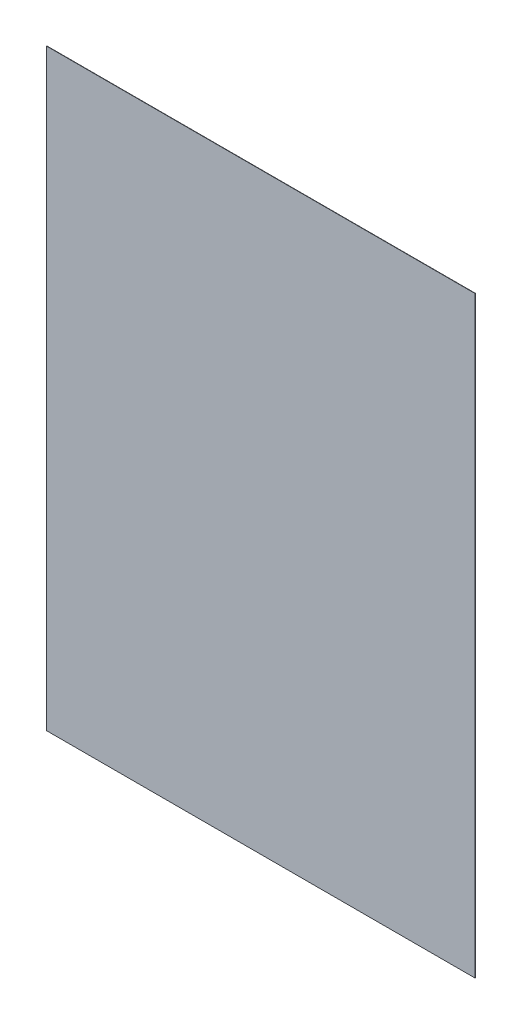
ISO-10303-21;
HEADER;
FILE_DESCRIPTION(('STEP AP214'),'2;1');
FILE_NAME('part.step','',(''),(''),'','','');
FILE_SCHEMA(('AUTOMOTIVE_DESIGN { 1 0 10303 214 1 1 1 1 }'));
ENDSEC;
DATA;
#1=APPLICATION_CONTEXT('core data for automotive mechanical design processes');
#2=APPLICATION_PROTOCOL_DEFINITION('international standard','automotive_design',2000,#1);
#3=PRODUCT_CONTEXT('',#1,'mechanical');
#4=PRODUCT('Part','Part','',(#3));
#5=PRODUCT_RELATED_PRODUCT_CATEGORY('part','',(#4));
#6=PRODUCT_DEFINITION_FORMATION('','',#4);
#7=PRODUCT_DEFINITION_CONTEXT('part definition',#1,'design');
#8=PRODUCT_DEFINITION('design','',#6,#7);
#9=PRODUCT_DEFINITION_SHAPE('','',#8);
#10=(LENGTH_UNIT() NAMED_UNIT(*) SI_UNIT(.MILLI.,.METRE.));
#11=(NAMED_UNIT(*) PLANE_ANGLE_UNIT() SI_UNIT($,.RADIAN.));
#12=(NAMED_UNIT(*) SI_UNIT($,.STERADIAN.) SOLID_ANGLE_UNIT());
#13=UNCERTAINTY_MEASURE_WITH_UNIT(LENGTH_MEASURE(1.E-05),#10,'distance_accuracy_value','');
#14=(GEOMETRIC_REPRESENTATION_CONTEXT(3) GLOBAL_UNCERTAINTY_ASSIGNED_CONTEXT((#13)) GLOBAL_UNIT_ASSIGNED_CONTEXT((#10,
#11,#12)) REPRESENTATION_CONTEXT('',''));
#15=CARTESIAN_POINT('',(0.,0.,0.));
#16=DIRECTION('',(0.,0.,1.));
#17=DIRECTION('',(1.,0.,0.));
#18=AXIS2_PLACEMENT_3D('',#15,#16,#17);
#19=CARTESIAN_POINT('',(0.,0.,-1.));
#20=DIRECTION('',(-1.,0.,0.));
#21=DIRECTION('',(0.,0.,1.));
#22=AXIS2_PLACEMENT_3D('',#19,#20,#21);
#23=PLANE('',#22);
#24=DIRECTION('',(0.,-1.,0.));
#25=VECTOR('',#24,1.);
#26=CARTESIAN_POINT('',(0.,0.,0.));
#27=LINE('',#26,#25);
#28=CARTESIAN_POINT('',(0.,1800.,0.));
#29=VERTEX_POINT('',#28);
#30=CARTESIAN_POINT('',(0.,0.,0.));
#31=VERTEX_POINT('',#30);
#32=EDGE_CURVE('E100',#29,#31,#27,.T.);
#33=ORIENTED_EDGE('',*,*,#32,.F.);
#34=DIRECTION('',(0.,0.,1.));
#35=VECTOR('',#34,1.);
#36=CARTESIAN_POINT('',(0.,1800.,-1.));
#37=LINE('',#36,#35);
#38=CARTESIAN_POINT('',(0.,1800.,-1.));
#39=VERTEX_POINT('',#38);
#40=EDGE_CURVE('E11',#39,#29,#37,.T.);
#41=ORIENTED_EDGE('',*,*,#40,.F.);
#42=DIRECTION('',(0.,-1.,0.));
#43=VECTOR('',#42,1.);
#44=CARTESIAN_POINT('',(0.,0.,-1.));
#45=LINE('',#44,#43);
#46=CARTESIAN_POINT('',(0.,0.,-1.));
#47=VERTEX_POINT('',#46);
#48=EDGE_CURVE('E94',#39,#47,#45,.T.);
#49=ORIENTED_EDGE('',*,*,#48,.T.);
#50=DIRECTION('',(0.,0.,1.));
#51=VECTOR('',#50,1.);
#52=CARTESIAN_POINT('',(0.,0.,-1.));
#53=LINE('',#52,#51);
#54=EDGE_CURVE('E39',#47,#31,#53,.T.);
#55=ORIENTED_EDGE('',*,*,#54,.T.);
#56=EDGE_LOOP('',(#33,#41,#49,#55));
#57=FACE_BOUND('',#56,.T.);
#58=ADVANCED_FACE('F36',(#57),#23,.T.);
#59=CARTESIAN_POINT('',(0.,1800.,-1.));
#60=DIRECTION('',(0.,1.,0.));
#61=DIRECTION('',(0.,0.,1.));
#62=AXIS2_PLACEMENT_3D('',#59,#60,#61);
#63=PLANE('',#62);
#64=DIRECTION('',(-1.,0.,0.));
#65=VECTOR('',#64,1.);
#66=CARTESIAN_POINT('',(0.,1800.,0.));
#67=LINE('',#66,#65);
#68=CARTESIAN_POINT('',(1300.,1800.,0.));
#69=VERTEX_POINT('',#68);
#70=EDGE_CURVE('E96',#69,#29,#67,.T.);
#71=ORIENTED_EDGE('',*,*,#70,.F.);
#72=DIRECTION('',(0.,0.,1.));
#73=VECTOR('',#72,1.);
#74=CARTESIAN_POINT('',(1300.,1800.,-1.));
#75=LINE('',#74,#73);
#76=CARTESIAN_POINT('',(1300.,1800.,-1.));
#77=VERTEX_POINT('',#76);
#78=EDGE_CURVE('E45',#77,#69,#75,.T.);
#79=ORIENTED_EDGE('',*,*,#78,.F.);
#80=DIRECTION('',(-1.,0.,0.));
#81=VECTOR('',#80,1.);
#82=CARTESIAN_POINT('',(0.,1800.,-1.));
#83=LINE('',#82,#81);
#84=EDGE_CURVE('E91',#77,#39,#83,.T.);
#85=ORIENTED_EDGE('',*,*,#84,.T.);
#86=ORIENTED_EDGE('',*,*,#40,.T.);
#87=EDGE_LOOP('',(#71,#79,#85,#86));
#88=FACE_BOUND('',#87,.T.);
#89=ADVANCED_FACE('F110',(#88),#63,.T.);
#90=CARTESIAN_POINT('',(1300.,0.,-1.));
#91=DIRECTION('',(1.,0.,0.));
#92=DIRECTION('',(0.,0.,-1.));
#93=AXIS2_PLACEMENT_3D('',#90,#91,#92);
#94=PLANE('',#93);
#95=DIRECTION('',(0.,1.,0.));
#96=VECTOR('',#95,1.);
#97=CARTESIAN_POINT('',(1300.,0.,0.));
#98=LINE('',#97,#96);
#99=CARTESIAN_POINT('',(1300.,0.,0.));
#100=VERTEX_POINT('',#99);
#101=EDGE_CURVE('E86',#100,#69,#98,.T.);
#102=ORIENTED_EDGE('',*,*,#101,.F.);
#103=DIRECTION('',(0.,0.,1.));
#104=VECTOR('',#103,1.);
#105=CARTESIAN_POINT('',(1300.,0.,-1.));
#106=LINE('',#105,#104);
#107=CARTESIAN_POINT('',(1300.,0.,-1.));
#108=VERTEX_POINT('',#107);
#109=EDGE_CURVE('E81',#108,#100,#106,.T.);
#110=ORIENTED_EDGE('',*,*,#109,.F.);
#111=DIRECTION('',(0.,1.,0.));
#112=VECTOR('',#111,1.);
#113=CARTESIAN_POINT('',(1300.,0.,-1.));
#114=LINE('',#113,#112);
#115=EDGE_CURVE('E84',#108,#77,#114,.T.);
#116=ORIENTED_EDGE('',*,*,#115,.T.);
#117=ORIENTED_EDGE('',*,*,#78,.T.);
#118=EDGE_LOOP('',(#102,#110,#116,#117));
#119=FACE_BOUND('',#118,.T.);
#120=ADVANCED_FACE('F83',(#119),#94,.T.);
#121=CARTESIAN_POINT('',(0.,0.,-1.));
#122=DIRECTION('',(0.,-1.,0.));
#123=DIRECTION('',(0.,0.,-1.));
#124=AXIS2_PLACEMENT_3D('',#121,#122,#123);
#125=PLANE('',#124);
#126=DIRECTION('',(1.,0.,0.));
#127=VECTOR('',#126,1.);
#128=CARTESIAN_POINT('',(0.,0.,0.));
#129=LINE('',#128,#127);
#130=EDGE_CURVE('E103',#31,#100,#129,.T.);
#131=ORIENTED_EDGE('',*,*,#130,.F.);
#132=ORIENTED_EDGE('',*,*,#54,.F.);
#133=DIRECTION('',(1.,0.,0.));
#134=VECTOR('',#133,1.);
#135=CARTESIAN_POINT('',(0.,0.,-1.));
#136=LINE('',#135,#134);
#137=EDGE_CURVE('E90',#47,#108,#136,.T.);
#138=ORIENTED_EDGE('',*,*,#137,.T.);
#139=ORIENTED_EDGE('',*,*,#109,.T.);
#140=EDGE_LOOP('',(#131,#132,#138,#139));
#141=FACE_BOUND('',#140,.T.);
#142=ADVANCED_FACE('F93',(#141),#125,.T.);
#143=CARTESIAN_POINT('',(0.,0.,-1.));
#144=DIRECTION('',(0.,0.,-1.));
#145=DIRECTION('',(-1.,0.,0.));
#146=AXIS2_PLACEMENT_3D('',#143,#144,#145);
#147=PLANE('',#146);
#148=ORIENTED_EDGE('',*,*,#48,.F.);
#149=ORIENTED_EDGE('',*,*,#84,.F.);
#150=ORIENTED_EDGE('',*,*,#115,.F.);
#151=ORIENTED_EDGE('',*,*,#137,.F.);
#152=EDGE_LOOP('',(#148,#149,#150,#151));
#153=FACE_BOUND('',#152,.T.);
#154=ADVANCED_FACE('F89',(#153),#147,.T.);
#155=CARTESIAN_POINT('',(0.,0.,0.));
#156=DIRECTION('',(0.,0.,-1.));
#157=DIRECTION('',(-1.,0.,0.));
#158=AXIS2_PLACEMENT_3D('',#155,#156,#157);
#159=PLANE('',#158);
#160=ORIENTED_EDGE('',*,*,#32,.T.);
#161=ORIENTED_EDGE('',*,*,#130,.T.);
#162=ORIENTED_EDGE('',*,*,#101,.T.);
#163=ORIENTED_EDGE('',*,*,#70,.T.);
#164=EDGE_LOOP('',(#160,#161,#162,#163));
#165=FACE_BOUND('',#164,.T.);
#166=ADVANCED_FACE('F109',(#165),#159,.F.);
#167=CLOSED_SHELL('',(#58,#89,#120,#142,#154,#166));
#168=MANIFOLD_SOLID_BREP('B2',#167);
#169=ADVANCED_BREP_SHAPE_REPRESENTATION('',(#18,#168),#14);
#170=SHAPE_DEFINITION_REPRESENTATION(#9,#169);
ENDSEC;
END-ISO-10303-21;
